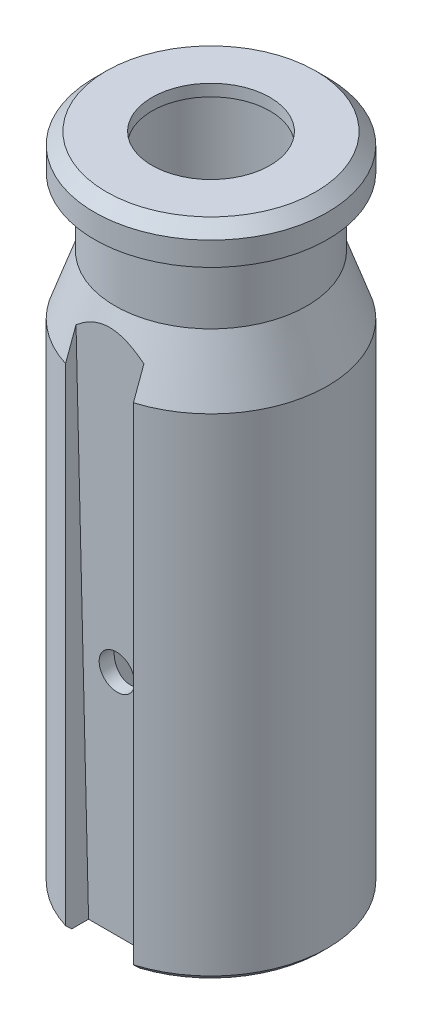
ISO-10303-21;
HEADER;
FILE_DESCRIPTION(('STEP AP214'),'2;1');
FILE_NAME('part.step','',(''),(''),'','','');
FILE_SCHEMA(('AUTOMOTIVE_DESIGN { 1 0 10303 214 1 1 1 1 }'));
ENDSEC;
DATA;
#1=APPLICATION_CONTEXT('core data for automotive mechanical design processes');
#2=APPLICATION_PROTOCOL_DEFINITION('international standard','automotive_design',2000,#1);
#3=PRODUCT_CONTEXT('',#1,'mechanical');
#4=PRODUCT('Part','Part','',(#3));
#5=PRODUCT_RELATED_PRODUCT_CATEGORY('part','',(#4));
#6=PRODUCT_DEFINITION_FORMATION('','',#4);
#7=PRODUCT_DEFINITION_CONTEXT('part definition',#1,'design');
#8=PRODUCT_DEFINITION('design','',#6,#7);
#9=PRODUCT_DEFINITION_SHAPE('','',#8);
#10=(LENGTH_UNIT() NAMED_UNIT(*) SI_UNIT(.MILLI.,.METRE.));
#11=(NAMED_UNIT(*) PLANE_ANGLE_UNIT() SI_UNIT($,.RADIAN.));
#12=(NAMED_UNIT(*) SI_UNIT($,.STERADIAN.) SOLID_ANGLE_UNIT());
#13=UNCERTAINTY_MEASURE_WITH_UNIT(LENGTH_MEASURE(1.E-05),#10,'distance_accuracy_value','');
#14=(GEOMETRIC_REPRESENTATION_CONTEXT(3) GLOBAL_UNCERTAINTY_ASSIGNED_CONTEXT((#13)) GLOBAL_UNIT_ASSIGNED_CONTEXT((#10,
#11,#12)) REPRESENTATION_CONTEXT('',''));
#15=CARTESIAN_POINT('',(0.,0.,0.));
#16=DIRECTION('',(0.,0.,1.));
#17=DIRECTION('',(1.,0.,0.));
#18=AXIS2_PLACEMENT_3D('',#15,#16,#17);
#19=CARTESIAN_POINT('',(1.3,0.,0.));
#20=DIRECTION('',(0.,-1.,0.));
#21=DIRECTION('',(0.,0.,-1.));
#22=AXIS2_PLACEMENT_3D('',#19,#20,#21);
#23=PLANE('',#22);
#24=CARTESIAN_POINT('',(0.,0.,0.));
#25=DIRECTION('',(0.,-1.,0.));
#26=DIRECTION('',(0.,0.,-1.));
#27=AXIS2_PLACEMENT_3D('',#24,#25,#26);
#28=CIRCLE('',#27,1.3);
#29=CARTESIAN_POINT('',(0.,0.,-1.3));
#30=VERTEX_POINT('',#29);
#31=EDGE_CURVE('E222',#30,#30,#28,.T.);
#32=ORIENTED_EDGE('',*,*,#31,.F.);
#33=EDGE_LOOP('',(#32));
#34=FACE_BOUND('',#33,.T.);
#35=CARTESIAN_POINT('',(0.,0.,0.));
#36=DIRECTION('',(0.,-1.,0.));
#37=DIRECTION('',(0.,0.,-1.));
#38=AXIS2_PLACEMENT_3D('',#35,#36,#37);
#39=CIRCLE('',#38,3.75);
#40=CARTESIAN_POINT('',(1.15,0.,-3.56931365951495));
#41=VERTEX_POINT('',#40);
#42=CARTESIAN_POINT('',(1.15,0.,3.56931365951495));
#43=VERTEX_POINT('',#42);
#44=EDGE_CURVE('E116',#41,#43,#39,.T.);
#45=ORIENTED_EDGE('',*,*,#44,.T.);
#46=DIRECTION('',(0.,0.,-1.));
#47=VECTOR('',#46,1.);
#48=CARTESIAN_POINT('',(1.15,0.,3.95));
#49=LINE('',#48,#47);
#50=CARTESIAN_POINT('',(1.15,0.,3.));
#51=VERTEX_POINT('',#50);
#52=EDGE_CURVE('E100',#43,#51,#49,.T.);
#53=ORIENTED_EDGE('',*,*,#52,.T.);
#54=DIRECTION('',(-1.,0.,0.));
#55=VECTOR('',#54,1.);
#56=CARTESIAN_POINT('',(1.15,0.,3.));
#57=LINE('',#56,#55);
#58=CARTESIAN_POINT('',(-1.15,0.,3.));
#59=VERTEX_POINT('',#58);
#60=EDGE_CURVE('E107',#51,#59,#57,.T.);
#61=ORIENTED_EDGE('',*,*,#60,.T.);
#62=DIRECTION('',(0.,0.,1.));
#63=VECTOR('',#62,1.);
#64=CARTESIAN_POINT('',(-1.15,0.,3.95));
#65=LINE('',#64,#63);
#66=CARTESIAN_POINT('',(-1.15,0.,3.56931365951495));
#67=VERTEX_POINT('',#66);
#68=EDGE_CURVE('E111',#59,#67,#65,.T.);
#69=ORIENTED_EDGE('',*,*,#68,.T.);
#70=CARTESIAN_POINT('',(-1.15,0.,-3.56931365951495));
#71=VERTEX_POINT('',#70);
#72=EDGE_CURVE('E126',#67,#71,#39,.T.);
#73=ORIENTED_EDGE('',*,*,#72,.T.);
#74=DIRECTION('',(0.,0.,-1.));
#75=VECTOR('',#74,1.);
#76=CARTESIAN_POINT('',(-1.15,0.,-3.95));
#77=LINE('',#76,#75);
#78=CARTESIAN_POINT('',(-1.15,0.,-3.));
#79=VERTEX_POINT('',#78);
#80=EDGE_CURVE('E140',#79,#71,#77,.T.);
#81=ORIENTED_EDGE('',*,*,#80,.F.);
#82=DIRECTION('',(-1.,0.,0.));
#83=VECTOR('',#82,1.);
#84=CARTESIAN_POINT('',(1.15,0.,-3.));
#85=LINE('',#84,#83);
#86=CARTESIAN_POINT('',(1.15,0.,-3.));
#87=VERTEX_POINT('',#86);
#88=EDGE_CURVE('E144',#87,#79,#85,.T.);
#89=ORIENTED_EDGE('',*,*,#88,.F.);
#90=DIRECTION('',(0.,0.,1.));
#91=VECTOR('',#90,1.);
#92=CARTESIAN_POINT('',(1.15,0.,-3.95));
#93=LINE('',#92,#91);
#94=EDGE_CURVE('E150',#41,#87,#93,.T.);
#95=ORIENTED_EDGE('',*,*,#94,.F.);
#96=EDGE_LOOP('',(#45,#53,#61,#69,#73,#81,#89,#95));
#97=FACE_BOUND('',#96,.T.);
#98=ADVANCED_FACE('F17',(#34,#97),#23,.T.);
#99=CARTESIAN_POINT('',(0.,0.,0.));
#100=DIRECTION('',(0.,1.,0.));
#101=DIRECTION('',(0.,0.,1.));
#102=AXIS2_PLACEMENT_3D('',#99,#100,#101);
#103=CONICAL_SURFACE('',#102,3.75,0.785398163397447);
#104=CARTESIAN_POINT('',(0.,0.2,0.));
#105=DIRECTION('',(0.,-1.,0.));
#106=DIRECTION('',(0.,0.,-1.));
#107=AXIS2_PLACEMENT_3D('',#104,#105,#106);
#108=CIRCLE('',#107,3.95);
#109=CARTESIAN_POINT('',(1.15,0.2,-3.77888872553824));
#110=VERTEX_POINT('',#109);
#111=CARTESIAN_POINT('',(1.15,0.2,3.77888872553824));
#112=VERTEX_POINT('',#111);
#113=EDGE_CURVE('E128',#110,#112,#108,.T.);
#114=ORIENTED_EDGE('',*,*,#113,.T.);
#115=CARTESIAN_POINT('',(1.15,0.200225,3.77912391310804));
#116=CARTESIAN_POINT('',(1.15,0.16675950570913,3.74414562733071));
#117=CARTESIAN_POINT('',(1.15,0.133316342073734,3.70914603116538));
#118=CARTESIAN_POINT('',(1.15,0.0664746754061209,3.63910421731704));
#119=CARTESIAN_POINT('',(1.15,0.0330761723748503,3.60406199963314));
#120=CARTESIAN_POINT('',(1.15,-0.000300000000000059,3.56899847156033));
#121=B_SPLINE_CURVE_WITH_KNOTS('',3,(#115,#116,#117,#118,#119,#120),.UNSPECIFIED.,.F.,.F.,(4,2,
4),(0.,0.14522655518576,0.290453113447055),.UNSPECIFIED.);
#122=EDGE_CURVE('E528',#112,#43,#121,.T.);
#123=ORIENTED_EDGE('',*,*,#122,.T.);
#124=ORIENTED_EDGE('',*,*,#44,.F.);
#125=CARTESIAN_POINT('',(1.15,-0.000200000000000068,-3.56910353450275));
#126=CARTESIAN_POINT('',(1.15,0.0331553961812222,-3.60414514228176));
#127=CARTESIAN_POINT('',(1.15,0.0665330944485576,-3.6391654669155));
#128=CARTESIAN_POINT('',(1.15,0.1333330944495,-3.70916354915272));
#129=CARTESIAN_POINT('',(1.15,0.166755396182165,-3.74414130675709));
#130=CARTESIAN_POINT('',(1.15,0.2002,-3.7790977812171));
#131=B_SPLINE_CURVE_WITH_KNOTS('',3,(#125,#126,#127,#128,#129,#130),.UNSPECIFIED.,.F.,.F.,(4,2,
4),(0.,0.145135953201489,0.290271903335335),.UNSPECIFIED.);
#132=EDGE_CURVE('E220',#41,#110,#131,.T.);
#133=ORIENTED_EDGE('',*,*,#132,.T.);
#134=EDGE_LOOP('',(#114,#123,#124,#133));
#135=FACE_BOUND('',#134,.T.);
#136=ADVANCED_FACE('F193',(#135),#103,.T.);
#137=ORIENTED_EDGE('',*,*,#72,.F.);
#138=CARTESIAN_POINT('',(-1.15,-0.000299999999999731,3.56899847156033));
#139=CARTESIAN_POINT('',(-1.15,0.0330761723748504,3.60406199963314));
#140=CARTESIAN_POINT('',(-1.15,0.0664746754061209,3.63910421731704));
#141=CARTESIAN_POINT('',(-1.15,0.133316342073733,3.70914603116538));
#142=CARTESIAN_POINT('',(-1.15,0.16675950570913,3.74414562733071));
#143=CARTESIAN_POINT('',(-1.15,0.200225,3.77912391310804));
#144=B_SPLINE_CURVE_WITH_KNOTS('',3,(#138,#139,#140,#141,#142,#143),.UNSPECIFIED.,.F.,.F.,(4,2,
4),(0.,0.145226558261294,0.290453113447055),.UNSPECIFIED.);
#145=CARTESIAN_POINT('',(-1.15,0.2,3.77888872553824));
#146=VERTEX_POINT('',#145);
#147=EDGE_CURVE('E118',#67,#146,#144,.T.);
#148=ORIENTED_EDGE('',*,*,#147,.T.);
#149=CARTESIAN_POINT('',(-1.15,0.2,-3.77888872553824));
#150=VERTEX_POINT('',#149);
#151=EDGE_CURVE('E258',#146,#150,#108,.T.);
#152=ORIENTED_EDGE('',*,*,#151,.T.);
#153=CARTESIAN_POINT('',(-1.15,0.2002,-3.7790977812171));
#154=CARTESIAN_POINT('',(-1.15,0.166755396182165,-3.74414130675709));
#155=CARTESIAN_POINT('',(-1.15,0.1333330944495,-3.70916354915272));
#156=CARTESIAN_POINT('',(-1.15,0.0665330944485576,-3.63916546691551));
#157=CARTESIAN_POINT('',(-1.15,0.0331553961812223,-3.60414514228176));
#158=CARTESIAN_POINT('',(-1.15,-0.000199999999999869,-3.56910353450275));
#159=B_SPLINE_CURVE_WITH_KNOTS('',3,(#153,#154,#155,#156,#157,#158),.UNSPECIFIED.,.F.,.F.,(4,2,
4),(0.,0.145135950133845,0.290271903335334),.UNSPECIFIED.);
#160=EDGE_CURVE('E537',#150,#71,#159,.T.);
#161=ORIENTED_EDGE('',*,*,#160,.T.);
#162=EDGE_LOOP('',(#137,#148,#152,#161));
#163=FACE_BOUND('',#162,.T.);
#164=ADVANCED_FACE('F196',(#163),#103,.T.);
#165=CARTESIAN_POINT('',(0.,0.,0.));
#166=DIRECTION('',(0.,-1.,0.));
#167=DIRECTION('',(0.,0.,-1.));
#168=AXIS2_PLACEMENT_3D('',#165,#166,#167);
#169=CYLINDRICAL_SURFACE('',#168,3.95);
#170=CARTESIAN_POINT('',(0.,16.7,0.));
#171=DIRECTION('',(0.,-1.,0.));
#172=DIRECTION('',(0.,0.,-1.));
#173=AXIS2_PLACEMENT_3D('',#170,#171,#172);
#174=CIRCLE('',#173,3.95);
#175=CARTESIAN_POINT('',(1.15,16.7,-3.77888872553824));
#176=VERTEX_POINT('',#175);
#177=CARTESIAN_POINT('',(1.15,16.7,3.77888872553824));
#178=VERTEX_POINT('',#177);
#179=EDGE_CURVE('E255',#176,#178,#174,.T.);
#180=ORIENTED_EDGE('',*,*,#179,.T.);
#181=DIRECTION('',(0.,-1.,0.));
#182=VECTOR('',#181,1.);
#183=CARTESIAN_POINT('',(1.15,0.,3.77888872553824));
#184=LINE('',#183,#182);
#185=EDGE_CURVE('E552',#178,#112,#184,.T.);
#186=ORIENTED_EDGE('',*,*,#185,.T.);
#187=ORIENTED_EDGE('',*,*,#113,.F.);
#188=DIRECTION('',(0.,-1.,0.));
#189=VECTOR('',#188,1.);
#190=CARTESIAN_POINT('',(1.15,0.,-3.77888872553824));
#191=LINE('',#190,#189);
#192=EDGE_CURVE('E535',#110,#176,#191,.F.);
#193=ORIENTED_EDGE('',*,*,#192,.T.);
#194=EDGE_LOOP('',(#180,#186,#187,#193));
#195=FACE_BOUND('',#194,.T.);
#196=ADVANCED_FACE('F198',(#195),#169,.T.);
#197=ORIENTED_EDGE('',*,*,#151,.F.);
#198=DIRECTION('',(0.,-1.,0.));
#199=VECTOR('',#198,1.);
#200=CARTESIAN_POINT('',(-1.15,0.,3.77888872553824));
#201=LINE('',#200,#199);
#202=CARTESIAN_POINT('',(-1.15,16.7,3.77888872553824));
#203=VERTEX_POINT('',#202);
#204=EDGE_CURVE('E117',#146,#203,#201,.F.);
#205=ORIENTED_EDGE('',*,*,#204,.T.);
#206=CARTESIAN_POINT('',(-1.15,16.7,-3.77888872553824));
#207=VERTEX_POINT('',#206);
#208=EDGE_CURVE('E41',#203,#207,#174,.T.);
#209=ORIENTED_EDGE('',*,*,#208,.T.);
#210=DIRECTION('',(0.,-1.,0.));
#211=VECTOR('',#210,1.);
#212=CARTESIAN_POINT('',(-1.15,0.,-3.77888872553824));
#213=LINE('',#212,#211);
#214=EDGE_CURVE('E154',#207,#150,#213,.T.);
#215=ORIENTED_EDGE('',*,*,#214,.T.);
#216=EDGE_LOOP('',(#197,#205,#209,#215));
#217=FACE_BOUND('',#216,.T.);
#218=ADVANCED_FACE('F324',(#217),#169,.T.);
#219=CARTESIAN_POINT('',(0.,16.7,0.));
#220=DIRECTION('',(0.,-1.,0.));
#221=DIRECTION('',(0.,0.,-1.));
#222=AXIS2_PLACEMENT_3D('',#219,#220,#221);
#223=CONICAL_SURFACE('',#222,3.95,0.336674819386727);
#224=CARTESIAN_POINT('',(0.,18.7,0.));
#225=DIRECTION('',(0.,-1.,0.));
#226=DIRECTION('',(0.,0.,-1.));
#227=AXIS2_PLACEMENT_3D('',#224,#225,#226);
#228=CIRCLE('',#227,3.25);
#229=CARTESIAN_POINT('',(0.,18.7,-3.25));
#230=VERTEX_POINT('',#229);
#231=EDGE_CURVE('E252',#230,#230,#228,.T.);
#232=ORIENTED_EDGE('',*,*,#231,.T.);
#233=EDGE_LOOP('',(#232));
#234=FACE_BOUND('',#233,.T.);
#235=CARTESIAN_POINT('',(-1.1503,17.6627331962136,3.42503903413348));
#236=CARTESIAN_POINT('',(-1.11340986937978,17.6942265538726,3.42579689568143));
#237=CARTESIAN_POINT('',(-1.07584878108211,17.7249329414148,3.42653581944581));
#238=CARTESIAN_POINT('',(-0.999194089284043,17.7844779764666,3.42796872135882));
#239=CARTESIAN_POINT('',(-0.960098448803349,17.813313996706,3.42866263628437));
#240=CARTESIAN_POINT('',(-0.838767381594023,17.8975653770501,3.43069007591832));
#241=CARTESIAN_POINT('',(-0.753966097119917,17.9494222485725,3.43193796854854));
#242=CARTESIAN_POINT('',(-0.576330428398146,18.0398971314686,3.43411517161288));
#243=CARTESIAN_POINT('',(-0.483428009821175,18.0783860796479,3.43504137624821));
#244=CARTESIAN_POINT('',(-0.292371766603162,18.1355722067019,3.4364175129955));
#245=CARTESIAN_POINT('',(-0.194277493685058,18.1544573983353,3.43687196947866));
#246=CARTESIAN_POINT('',(-0.0102472295720071,18.1681115244492,3.437200544706));
#247=CARTESIAN_POINT('',(0.0754639963956187,18.1658918347715,3.43714712971375));
#248=CARTESIAN_POINT('',(0.244991873251715,18.1448144305306,3.43663991945127));
#249=CARTESIAN_POINT('',(0.328801908076904,18.1259057137957,3.43618489685605));
#250=CARTESIAN_POINT('',(0.507408868400063,18.0692770282759,3.43482217447723));
#251=CARTESIAN_POINT('',(0.60125689990116,18.028659491094,3.43384474711189));
#252=CARTESIAN_POINT('',(0.78153405653423,17.9334249535095,3.43155300690264));
#253=CARTESIAN_POINT('',(0.867945385931423,17.8787755545299,3.43023791441382));
#254=CARTESIAN_POINT('',(0.985331128168245,17.7947107302308,3.42821496409646));
#255=CARTESIAN_POINT('',(1.01920945671224,17.7691972895163,3.42760100429317));
#256=CARTESIAN_POINT('',(1.08565647121131,17.7168954142107,3.42634240301577));
#257=CARTESIAN_POINT('',(1.11823151905257,17.6901150719987,3.42569795627804));
#258=CARTESIAN_POINT('',(1.1503,17.6627331962136,3.42503903413348));
#259=B_SPLINE_CURVE_WITH_KNOTS('',3,(#235,#236,#237,#238,#239,#240,#241,#242,#243,#244,#245,
#246,#247,#248,#249,#250,#251,#252,#253,#254,#255,#256,#257,#258),.UNSPECIFIED.,.F.,.F.,(4,2,2,
2,2,2,2,2,2,2,2,4),(0.,0.14550977082224,0.291219697585221,0.588520120205237,0.888615916346047,
1.18580623469195,1.44130702487727,1.69759134729063,2.0027028441205,2.30852525816984,
2.4357464331425,2.56224277385796),.UNSPECIFIED.);
#260=CARTESIAN_POINT('',(-1.15,17.6629893599923,3.42504519850249));
#261=VERTEX_POINT('',#260);
#262=CARTESIAN_POINT('',(1.15,17.6629893599923,3.42504519850249));
#263=VERTEX_POINT('',#262);
#264=EDGE_CURVE('E25',#261,#263,#259,.T.);
#265=ORIENTED_EDGE('',*,*,#264,.T.);
#266=CARTESIAN_POINT('',(1.15,18.7002,3.03966198859347));
#267=CARTESIAN_POINT('',(1.15,18.5337505302106,3.10194646119254));
#268=CARTESIAN_POINT('',(1.15,18.3672243723403,3.1640255817215));
#269=CARTESIAN_POINT('',(1.15,18.0340409723636,3.28782941284661));
#270=CARTESIAN_POINT('',(1.15,17.8673837306944,3.3495541246194));
#271=CARTESIAN_POINT('',(1.15,17.5339595001939,3.47270578961336));
#272=CARTESIAN_POINT('',(1.15,17.3671925114622,3.5341327431047));
#273=CARTESIAN_POINT('',(1.15,17.0335635195748,3.65672982321873));
#274=CARTESIAN_POINT('',(1.15,16.866701516106,3.71789994898949));
#275=CARTESIAN_POINT('',(1.15,16.6998,3.77896189513734));
#276=B_SPLINE_CURVE_WITH_KNOTS('',3,(#266,#267,#268,#269,#270,#271,#272,#273,#274,#275),
.UNSPECIFIED.,.F.,.F.,(4,2,2,2,4),(0.,0.533162891940487,1.06632401278206,1.59948464980143,
2.13264705396192),.UNSPECIFIED.);
#277=EDGE_CURVE('E11',#263,#178,#276,.T.);
#278=ORIENTED_EDGE('',*,*,#277,.T.);
#279=ORIENTED_EDGE('',*,*,#179,.F.);
#280=CARTESIAN_POINT('',(1.15,16.6998,-3.77896189513734));
#281=CARTESIAN_POINT('',(1.15,16.866701516106,-3.71789994898949));
#282=CARTESIAN_POINT('',(1.15,17.0335635195748,-3.65672982321873));
#283=CARTESIAN_POINT('',(1.15,17.3671925114622,-3.5341327431047));
#284=CARTESIAN_POINT('',(1.15,17.5339595001939,-3.47270578961337));
#285=CARTESIAN_POINT('',(1.15,17.8673837306944,-3.3495541246194));
#286=CARTESIAN_POINT('',(1.15,18.0340409723636,-3.28782941284661));
#287=CARTESIAN_POINT('',(1.15,18.3672243723403,-3.1640255817215));
#288=CARTESIAN_POINT('',(1.15,18.5337505302106,-3.10194646119254));
#289=CARTESIAN_POINT('',(1.15,18.7002,-3.03966198859348));
#290=B_SPLINE_CURVE_WITH_KNOTS('',3,(#280,#281,#282,#283,#284,#285,#286,#287,#288,#289),
.UNSPECIFIED.,.F.,.F.,(4,2,2,2,4),(0.,0.533162404160496,1.06632304117986,1.59948416202143,
2.13264705396192),.UNSPECIFIED.);
#291=CARTESIAN_POINT('',(1.15,17.6629893599923,-3.42504519850249));
#292=VERTEX_POINT('',#291);
#293=EDGE_CURVE('E164',#176,#292,#290,.T.);
#294=ORIENTED_EDGE('',*,*,#293,.T.);
#295=CARTESIAN_POINT('',(1.1503,17.6627331962136,-3.42503903413348));
#296=CARTESIAN_POINT('',(1.11340986937978,17.6942265538726,-3.42579689568143));
#297=CARTESIAN_POINT('',(1.07584878108211,17.7249329414148,-3.42653581944581));
#298=CARTESIAN_POINT('',(0.999194089284043,17.7844779764666,-3.42796872135882));
#299=CARTESIAN_POINT('',(0.960098448803349,17.813313996706,-3.42866263628437));
#300=CARTESIAN_POINT('',(0.838767381594022,17.8975653770501,-3.43069007591832));
#301=CARTESIAN_POINT('',(0.753966097119915,17.9494222485725,-3.43193796854854));
#302=CARTESIAN_POINT('',(0.576330428398144,18.0398971314686,-3.43411517161288));
#303=CARTESIAN_POINT('',(0.483428009821173,18.0783860796479,-3.43504137624821));
#304=CARTESIAN_POINT('',(0.292371766603159,18.1355722067019,-3.4364175129955));
#305=CARTESIAN_POINT('',(0.194277493685054,18.1544573983353,-3.43687196947866));
#306=CARTESIAN_POINT('',(0.0102472295720029,18.1681115244492,-3.437200544706));
#307=CARTESIAN_POINT('',(-0.0754639963956222,18.1658918347715,-3.43714712971375));
#308=CARTESIAN_POINT('',(-0.244991873251718,18.1448144305306,-3.43663991945127));
#309=CARTESIAN_POINT('',(-0.328801908076907,18.1259057137957,-3.43618489685605));
#310=CARTESIAN_POINT('',(-0.507408868400066,18.0692770282759,-3.43482217447723));
#311=CARTESIAN_POINT('',(-0.601256899901163,18.028659491094,-3.43384474711189));
#312=CARTESIAN_POINT('',(-0.781534056534232,17.9334249535095,-3.43155300690264));
#313=CARTESIAN_POINT('',(-0.867945385931425,17.8787755545299,-3.43023791441382));
#314=CARTESIAN_POINT('',(-0.985331128168246,17.7947107302308,-3.42821496409646));
#315=CARTESIAN_POINT('',(-1.01920945671224,17.7691972895163,-3.42760100429317));
#316=CARTESIAN_POINT('',(-1.08565647121131,17.7168954142107,-3.42634240301577));
#317=CARTESIAN_POINT('',(-1.11823151905257,17.6901150719987,-3.42569795627804));
#318=CARTESIAN_POINT('',(-1.1503,17.6627331962136,-3.42503903413348));
#319=B_SPLINE_CURVE_WITH_KNOTS('',3,(#295,#296,#297,#298,#299,#300,#301,#302,#303,#304,#305,
#306,#307,#308,#309,#310,#311,#312,#313,#314,#315,#316,#317,#318),.UNSPECIFIED.,.F.,.F.,(4,2,2,
2,2,2,2,2,2,2,2,4),(0.,0.145509770822242,0.291219697585223,0.58852012020524,0.888615916346052,
1.18580623469195,1.44130702487728,1.69759134729064,2.0027028441205,2.30852525816984,
2.43574643314251,2.56224277385796),.UNSPECIFIED.);
#320=CARTESIAN_POINT('',(-1.15,17.6629893599923,-3.42504519850249));
#321=VERTEX_POINT('',#320);
#322=EDGE_CURVE('E268',#292,#321,#319,.T.);
#323=ORIENTED_EDGE('',*,*,#322,.T.);
#324=CARTESIAN_POINT('',(-1.15,18.7002,-3.03966198859347));
#325=CARTESIAN_POINT('',(-1.15,18.5337505302106,-3.10194646119254));
#326=CARTESIAN_POINT('',(-1.15,18.3672243723403,-3.1640255817215));
#327=CARTESIAN_POINT('',(-1.15,18.0340409723636,-3.28782941284661));
#328=CARTESIAN_POINT('',(-1.15,17.8673837306944,-3.3495541246194));
#329=CARTESIAN_POINT('',(-1.15,17.5339595001939,-3.47270578961336));
#330=CARTESIAN_POINT('',(-1.15,17.3671925114622,-3.5341327431047));
#331=CARTESIAN_POINT('',(-1.15,17.0335635195748,-3.65672982321872));
#332=CARTESIAN_POINT('',(-1.15,16.866701516106,-3.71789994898949));
#333=CARTESIAN_POINT('',(-1.15,16.6998,-3.77896189513734));
#334=B_SPLINE_CURVE_WITH_KNOTS('',3,(#324,#325,#326,#327,#328,#329,#330,#331,#332,#333),
.UNSPECIFIED.,.F.,.F.,(4,2,2,2,4),(0.,0.533162891940483,1.06632401278206,1.59948464980142,
2.13264705396192),.UNSPECIFIED.);
#335=EDGE_CURVE('E261',#321,#207,#334,.T.);
#336=ORIENTED_EDGE('',*,*,#335,.T.);
#337=ORIENTED_EDGE('',*,*,#208,.F.);
#338=CARTESIAN_POINT('',(-1.15,16.6998,3.77896189513734));
#339=CARTESIAN_POINT('',(-1.15,16.866701516106,3.71789994898949));
#340=CARTESIAN_POINT('',(-1.15,17.0335635195748,3.65672982321873));
#341=CARTESIAN_POINT('',(-1.15,17.3671925114622,3.5341327431047));
#342=CARTESIAN_POINT('',(-1.15,17.5339595001939,3.47270578961337));
#343=CARTESIAN_POINT('',(-1.15,17.8673837306944,3.3495541246194));
#344=CARTESIAN_POINT('',(-1.15,18.0340409723636,3.28782941284661));
#345=CARTESIAN_POINT('',(-1.15,18.3672243723403,3.1640255817215));
#346=CARTESIAN_POINT('',(-1.15,18.5337505302106,3.10194646119255));
#347=CARTESIAN_POINT('',(-1.15,18.7002,3.03966198859348));
#348=B_SPLINE_CURVE_WITH_KNOTS('',3,(#338,#339,#340,#341,#342,#343,#344,#345,#346,#347),
.UNSPECIFIED.,.F.,.F.,(4,2,2,2,4),(0.,0.533162404160496,1.06632304117986,1.59948416202143,
2.13264705396192),.UNSPECIFIED.);
#349=EDGE_CURVE('E157',#203,#261,#348,.T.);
#350=ORIENTED_EDGE('',*,*,#349,.T.);
#351=EDGE_LOOP('',(#265,#278,#279,#294,#323,#336,#337,#350));
#352=FACE_BOUND('',#351,.T.);
#353=ADVANCED_FACE('F170',(#234,#352),#223,.T.);
#354=CARTESIAN_POINT('',(0.,0.,0.));
#355=DIRECTION('',(0.,-1.,0.));
#356=DIRECTION('',(0.,0.,-1.));
#357=AXIS2_PLACEMENT_3D('',#354,#355,#356);
#358=CYLINDRICAL_SURFACE('',#357,3.25);
#359=CARTESIAN_POINT('',(0.,21.,0.));
#360=DIRECTION('',(0.,-1.,0.));
#361=DIRECTION('',(0.,0.,-1.));
#362=AXIS2_PLACEMENT_3D('',#359,#360,#361);
#363=CIRCLE('',#362,3.25);
#364=CARTESIAN_POINT('',(0.,21.,-3.25));
#365=VERTEX_POINT('',#364);
#366=EDGE_CURVE('E249',#365,#365,#363,.T.);
#367=ORIENTED_EDGE('',*,*,#366,.T.);
#368=EDGE_LOOP('',(#367));
#369=FACE_BOUND('',#368,.T.);
#370=ORIENTED_EDGE('',*,*,#231,.F.);
#371=EDGE_LOOP('',(#370));
#372=FACE_BOUND('',#371,.T.);
#373=ADVANCED_FACE('F315',(#369,#372),#358,.T.);
#374=CARTESIAN_POINT('',(3.25,21.,0.));
#375=DIRECTION('',(0.,-1.,0.));
#376=DIRECTION('',(0.,0.,-1.));
#377=AXIS2_PLACEMENT_3D('',#374,#375,#376);
#378=PLANE('',#377);
#379=CARTESIAN_POINT('',(0.,21.,0.));
#380=DIRECTION('',(0.,-1.,0.));
#381=DIRECTION('',(0.,0.,-1.));
#382=AXIS2_PLACEMENT_3D('',#379,#380,#381);
#383=CIRCLE('',#382,3.95);
#384=CARTESIAN_POINT('',(0.,21.,-3.95));
#385=VERTEX_POINT('',#384);
#386=EDGE_CURVE('E246',#385,#385,#383,.T.);
#387=ORIENTED_EDGE('',*,*,#386,.T.);
#388=EDGE_LOOP('',(#387));
#389=FACE_BOUND('',#388,.T.);
#390=ORIENTED_EDGE('',*,*,#366,.F.);
#391=EDGE_LOOP('',(#390));
#392=FACE_BOUND('',#391,.T.);
#393=ADVANCED_FACE('F312',(#389,#392),#378,.T.);
#394=CARTESIAN_POINT('',(0.,0.,0.));
#395=DIRECTION('',(0.,-1.,0.));
#396=DIRECTION('',(0.,0.,-1.));
#397=AXIS2_PLACEMENT_3D('',#394,#395,#396);
#398=CYLINDRICAL_SURFACE('',#397,3.95);
#399=CARTESIAN_POINT('',(0.,21.8,0.));
#400=DIRECTION('',(0.,-1.,0.));
#401=DIRECTION('',(0.,0.,-1.));
#402=AXIS2_PLACEMENT_3D('',#399,#400,#401);
#403=CIRCLE('',#402,3.95);
#404=CARTESIAN_POINT('',(0.,21.8,-3.95));
#405=VERTEX_POINT('',#404);
#406=EDGE_CURVE('E243',#405,#405,#403,.T.);
#407=ORIENTED_EDGE('',*,*,#406,.T.);
#408=EDGE_LOOP('',(#407));
#409=FACE_BOUND('',#408,.T.);
#410=ORIENTED_EDGE('',*,*,#386,.F.);
#411=EDGE_LOOP('',(#410));
#412=FACE_BOUND('',#411,.T.);
#413=ADVANCED_FACE('F308',(#409,#412),#398,.T.);
#414=CARTESIAN_POINT('',(0.,21.8,0.));
#415=DIRECTION('',(0.,-1.,0.));
#416=DIRECTION('',(0.,0.,-1.));
#417=AXIS2_PLACEMENT_3D('',#414,#415,#416);
#418=CONICAL_SURFACE('',#417,3.95,0.785398163397447);
#419=CARTESIAN_POINT('',(0.,22.2,0.));
#420=DIRECTION('',(0.,-1.,0.));
#421=DIRECTION('',(0.,0.,-1.));
#422=AXIS2_PLACEMENT_3D('',#419,#420,#421);
#423=CIRCLE('',#422,3.55);
#424=CARTESIAN_POINT('',(0.,22.2,-3.55));
#425=VERTEX_POINT('',#424);
#426=EDGE_CURVE('E240',#425,#425,#423,.T.);
#427=ORIENTED_EDGE('',*,*,#426,.T.);
#428=EDGE_LOOP('',(#427));
#429=FACE_BOUND('',#428,.T.);
#430=ORIENTED_EDGE('',*,*,#406,.F.);
#431=EDGE_LOOP('',(#430));
#432=FACE_BOUND('',#431,.T.);
#433=ADVANCED_FACE('F304',(#429,#432),#418,.T.);
#434=CARTESIAN_POINT('',(3.55,22.2,0.));
#435=DIRECTION('',(0.,1.,0.));
#436=DIRECTION('',(0.,0.,1.));
#437=AXIS2_PLACEMENT_3D('',#434,#435,#436);
#438=PLANE('',#437);
#439=CARTESIAN_POINT('',(0.,22.2,0.));
#440=DIRECTION('',(0.,-1.,0.));
#441=DIRECTION('',(0.,0.,-1.));
#442=AXIS2_PLACEMENT_3D('',#439,#440,#441);
#443=CIRCLE('',#442,2.00000000000001);
#444=CARTESIAN_POINT('',(0.,22.2,-2.00000000000001));
#445=VERTEX_POINT('',#444);
#446=EDGE_CURVE('E237',#445,#445,#443,.T.);
#447=ORIENTED_EDGE('',*,*,#446,.T.);
#448=EDGE_LOOP('',(#447));
#449=FACE_BOUND('',#448,.T.);
#450=ORIENTED_EDGE('',*,*,#426,.F.);
#451=EDGE_LOOP('',(#450));
#452=FACE_BOUND('',#451,.T.);
#453=ADVANCED_FACE('F300',(#449,#452),#438,.T.);
#454=CARTESIAN_POINT('',(0.,0.,0.));
#455=DIRECTION('',(0.,-1.,0.));
#456=DIRECTION('',(0.,0.,-1.));
#457=AXIS2_PLACEMENT_3D('',#454,#455,#456);
#458=CYLINDRICAL_SURFACE('',#457,2.00000000000001);
#459=CARTESIAN_POINT('',(0.,21.8,0.));
#460=DIRECTION('',(0.,-1.,0.));
#461=DIRECTION('',(0.,0.,-1.));
#462=AXIS2_PLACEMENT_3D('',#459,#460,#461);
#463=CIRCLE('',#462,2.00000000000001);
#464=CARTESIAN_POINT('',(0.,21.8,-2.00000000000001));
#465=VERTEX_POINT('',#464);
#466=EDGE_CURVE('E234',#465,#465,#463,.T.);
#467=ORIENTED_EDGE('',*,*,#466,.T.);
#468=EDGE_LOOP('',(#467));
#469=FACE_BOUND('',#468,.T.);
#470=ORIENTED_EDGE('',*,*,#446,.F.);
#471=EDGE_LOOP('',(#470));
#472=FACE_BOUND('',#471,.T.);
#473=ADVANCED_FACE('F296',(#469,#472),#458,.F.);
#474=CARTESIAN_POINT('',(2.00000000000001,21.8,0.));
#475=DIRECTION('',(0.,-1.,0.));
#476=DIRECTION('',(0.,0.,-1.));
#477=AXIS2_PLACEMENT_3D('',#474,#475,#476);
#478=PLANE('',#477);
#479=CARTESIAN_POINT('',(0.,21.8,0.));
#480=DIRECTION('',(0.,-1.,0.));
#481=DIRECTION('',(0.,0.,-1.));
#482=AXIS2_PLACEMENT_3D('',#479,#480,#481);
#483=CIRCLE('',#482,2.75000000000001);
#484=CARTESIAN_POINT('',(0.,21.8,-2.75000000000001));
#485=VERTEX_POINT('',#484);
#486=EDGE_CURVE('E231',#485,#485,#483,.T.);
#487=ORIENTED_EDGE('',*,*,#486,.T.);
#488=EDGE_LOOP('',(#487));
#489=FACE_BOUND('',#488,.T.);
#490=ORIENTED_EDGE('',*,*,#466,.F.);
#491=EDGE_LOOP('',(#490));
#492=FACE_BOUND('',#491,.T.);
#493=ADVANCED_FACE('F292',(#489,#492),#478,.T.);
#494=CARTESIAN_POINT('',(0.,0.,0.));
#495=DIRECTION('',(0.,-1.,0.));
#496=DIRECTION('',(0.,0.,-1.));
#497=AXIS2_PLACEMENT_3D('',#494,#495,#496);
#498=CYLINDRICAL_SURFACE('',#497,2.75000000000001);
#499=CARTESIAN_POINT('',(0.,7.33596583134108,2.75000000000001));
#500=CARTESIAN_POINT('',(0.0331659214326952,7.33596699578586,2.74999938913567));
#501=CARTESIAN_POINT('',(0.0663456058881966,7.33874069463018,2.74939388629404));
#502=CARTESIAN_POINT('',(0.131759530532624,7.34974693079521,2.74703717017002));
#503=CARTESIAN_POINT('',(0.163993071542689,7.35798340395398,2.7452851308393));
#504=CARTESIAN_POINT('',(0.226556699836022,7.37963353578691,2.74083106153913));
#505=CARTESIAN_POINT('',(0.256888988161396,7.39304107434399,2.73813015491918));
#506=CARTESIAN_POINT('',(0.314881423767141,7.42462429093625,2.73206898186275));
#507=CARTESIAN_POINT('',(0.342541607435513,7.44279990402856,2.72870872440702));
#508=CARTESIAN_POINT('',(0.394934724379752,7.48375941285474,2.7216241914402));
#509=CARTESIAN_POINT('',(0.419609415411235,7.50661689648398,2.71789466748437));
#510=CARTESIAN_POINT('',(0.464829691393052,7.55612118709563,2.71052752197805));
#511=CARTESIAN_POINT('',(0.485374788627002,7.58276844102647,2.70688991132707));
#512=CARTESIAN_POINT('',(0.522071334829777,7.63960060596122,2.70005492219873));
#513=CARTESIAN_POINT('',(0.53814770760675,7.66983504137468,2.69686546559033));
#514=CARTESIAN_POINT('',(0.564981037349098,7.73265473475451,2.69137237003753));
#515=CARTESIAN_POINT('',(0.575738545462899,7.76523974874939,2.68906863931844));
#516=CARTESIAN_POINT('',(0.5914682398766,7.83135437276796,2.68565259199219));
#517=CARTESIAN_POINT('',(0.596519615386489,7.86486426901519,2.68452398482042));
#518=CARTESIAN_POINT('',(0.600923530968317,7.93227326580655,2.68354176699104));
#519=CARTESIAN_POINT('',(0.600276914108151,7.96617230803189,2.68368796771441));
#520=CARTESIAN_POINT('',(0.593370128271301,8.03261474480009,2.68522316717104));
#521=CARTESIAN_POINT('',(0.58723243813251,8.06517158665916,2.68658504857318));
#522=CARTESIAN_POINT('',(0.569697647911581,8.12877168282488,2.69035764949983));
#523=CARTESIAN_POINT('',(0.558300395597492,8.15981489329246,2.69276839938252));
#524=CARTESIAN_POINT('',(0.530543545687235,8.21962928201133,2.69837423152007));
#525=CARTESIAN_POINT('',(0.514169413331348,8.24839349010891,2.70157160579332));
#526=CARTESIAN_POINT('',(0.476932075113571,8.30279653466839,2.70839307430804));
#527=CARTESIAN_POINT('',(0.456068325077486,8.32843499167596,2.71201722025319));
#528=CARTESIAN_POINT('',(0.409954186175092,8.37640123295886,2.71937350145316));
#529=CARTESIAN_POINT('',(0.3846247636183,8.39865297953102,2.72310635047855));
#530=CARTESIAN_POINT('',(0.330561152019509,8.43862055163096,2.73019623660498));
#531=CARTESIAN_POINT('',(0.301826851565273,8.45633622867238,2.73355326140156));
#532=CARTESIAN_POINT('',(0.241580623476384,8.48681059032789,2.73953620687157));
#533=CARTESIAN_POINT('',(0.210055315392808,8.49954361220255,2.74215832332228));
#534=CARTESIAN_POINT('',(0.145248745668964,8.51953700935685,2.74635322578008));
#535=CARTESIAN_POINT('',(0.111967681874761,8.52679799984495,2.74792612974553));
#536=CARTESIAN_POINT('',(0.0451379243216196,8.53555090282971,2.74982960280356));
#537=CARTESIAN_POINT('',(0.0116010548274332,8.53712911802085,2.75017875447943));
#538=CARTESIAN_POINT('',(-0.0552593011442838,8.53470683778165,2.74964796620387));
#539=CARTESIAN_POINT('',(-0.0885827994143573,8.53070665337748,2.74876809477717));
#540=CARTESIAN_POINT('',(-0.153755156429979,8.51731664959835,2.7458904378985));
#541=CARTESIAN_POINT('',(-0.185614755583385,8.50797671682825,2.74390300412756));
#542=CARTESIAN_POINT('',(-0.247309030666511,8.48422286686041,2.73903206712824));
#543=CARTESIAN_POINT('',(-0.277143552273508,8.46980856348267,2.73614849570215));
#544=CARTESIAN_POINT('',(-0.33432770848059,8.43611257736701,2.72975518369503));
#545=CARTESIAN_POINT('',(-0.361644018784109,8.41677568184482,2.72623848236448));
#546=CARTESIAN_POINT('',(-0.412665542952714,8.37384467740273,2.7189837080645));
#547=CARTESIAN_POINT('',(-0.436370384028618,8.35025012954061,2.71524561229715));
#548=CARTESIAN_POINT('',(-0.479830546224975,8.29907100141773,2.70790623688848));
#549=CARTESIAN_POINT('',(-0.499526731409327,8.27143576635172,2.70430756335646));
#550=CARTESIAN_POINT('',(-0.533984262599396,8.2131767313112,2.69771567115481));
#551=CARTESIAN_POINT('',(-0.548745935052892,8.18255312920843,2.69472241243852));
#552=CARTESIAN_POINT('',(-0.572787027348499,8.11943704146855,2.68971477334224));
#553=CARTESIAN_POINT('',(-0.582110502084632,8.08696198189943,2.6876925509257));
#554=CARTESIAN_POINT('',(-0.595169117521035,8.02085828979291,2.68483131604561));
#555=CARTESIAN_POINT('',(-0.598905056899758,7.98722982282584,2.68399213448));
#556=CARTESIAN_POINT('',(-0.600662252487389,7.92047358987892,2.68359934392617));
#557=CARTESIAN_POINT('',(-0.598793134074382,7.88734879078932,2.68402107318849));
#558=CARTESIAN_POINT('',(-0.589653341936792,7.82189161719763,2.68604363558474));
#559=CARTESIAN_POINT('',(-0.582382581246216,7.78955925546238,2.68764448770245));
#560=CARTESIAN_POINT('',(-0.562663449421889,7.72653184172611,2.69184150866654));
#561=CARTESIAN_POINT('',(-0.550207191918937,7.69583936431469,2.69443919307389));
#562=CARTESIAN_POINT('',(-0.520486299463961,7.63695199944261,2.70033748889517));
#563=CARTESIAN_POINT('',(-0.503221071461974,7.60875742059243,2.70363818699406));
#564=CARTESIAN_POINT('',(-0.463900810381157,7.55497280723304,2.71066466966109));
#565=CARTESIAN_POINT('',(-0.441744505682851,7.52945782610721,2.71439850151395));
#566=CARTESIAN_POINT('',(-0.393473859686591,7.48247444285014,2.72181436054254));
#567=CARTESIAN_POINT('',(-0.367358611983683,7.4610069699329,2.72549637564323));
#568=CARTESIAN_POINT('',(-0.311547815385953,7.42250997502106,2.73244152633115));
#569=CARTESIAN_POINT('',(-0.281815474978944,7.40553279847281,2.73569951394516));
#570=CARTESIAN_POINT('',(-0.219843861373389,7.37687324744432,2.74137433232467));
#571=CARTESIAN_POINT('',(-0.187606840840383,7.3651861782655,2.74379190846829));
#572=CARTESIAN_POINT('',(-0.129438338875106,7.34958942102422,2.7470680319333));
#573=CARTESIAN_POINT('',(-0.103832293363478,7.34449068910323,2.74816069237013));
#574=CARTESIAN_POINT('',(-0.0521536524512231,7.33767852567912,2.74962689762756));
#575=CARTESIAN_POINT('',(-0.0260810817285898,7.33596491564273,2.7500004803727));
#576=CARTESIAN_POINT('',(0.,7.33596583134108,2.75000000000001));
#577=B_SPLINE_CURVE_WITH_KNOTS('',3,(#499,#500,#501,#502,#503,#504,#505,#506,#507,#508,#509,
#510,#511,#512,#513,#514,#515,#516,#517,#518,#519,#520,#521,#522,#523,#524,#525,#526,#527,#528,
#529,#530,#531,#532,#533,#534,#535,#536,#537,#538,#539,#540,#541,#542,#543,#544,#545,#546,#547,
#548,#549,#550,#551,#552,#553,#554,#555,#556,#557,#558,#559,#560,#561,#562,#563,#564,#565,#566,
#567,#568,#569,#570,#571,#572,#573,#574,#575,#576),.UNSPECIFIED.,.T.,.F.,(4,2,2,2,2,2,2,2,2,2,2,
2,2,2,2,2,2,2,2,2,2,2,2,2,2,2,2,2,2,2,2,2,2,2,2,2,2,2,4),(0.,0.0994019643308978,
0.198875624035762,0.298231913058714,0.397586848883734,0.498643271329209,0.599711621812399,
0.702387423218752,0.805052582979554,0.90627475428671,1.00748194913828,1.10648648485333,
1.20549388632004,1.30479325901255,1.40410467429475,1.50539243788491,1.60668351666419,
1.70848962813796,1.81028429206602,1.91052635086101,2.01076282083882,2.11007778704159,
2.2094003131467,2.30989012351191,2.41039029978842,2.51227995869269,2.61416287564688,
2.71520854446923,2.81623976851249,2.91530796504716,3.01437775660614,3.11359877222943,
3.2128320293693,3.31435359881409,3.41589844695179,3.51857951385573,3.62116927706647,
3.69934130983576,3.77750921965722),.UNSPECIFIED.);
#578=CARTESIAN_POINT('',(0.,7.33596583134108,2.75000000000001));
#579=VERTEX_POINT('',#578);
#580=EDGE_CURVE('E507',#579,#579,#577,.T.);
#581=ORIENTED_EDGE('',*,*,#580,.T.);
#582=EDGE_LOOP('',(#581));
#583=FACE_BOUND('',#582,.T.);
#584=CARTESIAN_POINT('',(0.,4.,0.));
#585=DIRECTION('',(0.,-1.,0.));
#586=DIRECTION('',(0.,0.,-1.));
#587=AXIS2_PLACEMENT_3D('',#584,#585,#586);
#588=CIRCLE('',#587,2.75000000000002);
#589=CARTESIAN_POINT('',(0.,4.,-2.75000000000002));
#590=VERTEX_POINT('',#589);
#591=EDGE_CURVE('E228',#590,#590,#588,.T.);
#592=ORIENTED_EDGE('',*,*,#591,.T.);
#593=EDGE_LOOP('',(#592));
#594=FACE_BOUND('',#593,.T.);
#595=ORIENTED_EDGE('',*,*,#486,.F.);
#596=EDGE_LOOP('',(#595));
#597=FACE_BOUND('',#596,.T.);
#598=ADVANCED_FACE('F288',(#583,#594,#597),#498,.F.);
#599=CARTESIAN_POINT('',(1.3,4.,0.));
#600=DIRECTION('',(0.,1.,0.));
#601=DIRECTION('',(0.,0.,1.));
#602=AXIS2_PLACEMENT_3D('',#599,#600,#601);
#603=PLANE('',#602);
#604=CARTESIAN_POINT('',(0.,4.,0.));
#605=DIRECTION('',(0.,-1.,0.));
#606=DIRECTION('',(0.,0.,-1.));
#607=AXIS2_PLACEMENT_3D('',#604,#605,#606);
#608=CIRCLE('',#607,1.3);
#609=CARTESIAN_POINT('',(0.,4.,-1.3));
#610=VERTEX_POINT('',#609);
#611=EDGE_CURVE('E225',#610,#610,#608,.T.);
#612=ORIENTED_EDGE('',*,*,#611,.T.);
#613=EDGE_LOOP('',(#612));
#614=FACE_BOUND('',#613,.T.);
#615=ORIENTED_EDGE('',*,*,#591,.F.);
#616=EDGE_LOOP('',(#615));
#617=FACE_BOUND('',#616,.T.);
#618=ADVANCED_FACE('F284',(#614,#617),#603,.T.);
#619=CARTESIAN_POINT('',(0.,0.,0.));
#620=DIRECTION('',(0.,-1.,0.));
#621=DIRECTION('',(0.,0.,-1.));
#622=AXIS2_PLACEMENT_3D('',#619,#620,#621);
#623=CYLINDRICAL_SURFACE('',#622,1.3);
#624=ORIENTED_EDGE('',*,*,#31,.T.);
#625=EDGE_LOOP('',(#624));
#626=FACE_BOUND('',#625,.T.);
#627=ORIENTED_EDGE('',*,*,#611,.F.);
#628=EDGE_LOOP('',(#627));
#629=FACE_BOUND('',#628,.T.);
#630=ADVANCED_FACE('F280',(#626,#629),#623,.F.);
#631=CARTESIAN_POINT('',(1.15,0.,0.));
#632=DIRECTION('',(-1.,0.,0.));
#633=DIRECTION('',(0.,0.,1.));
#634=AXIS2_PLACEMENT_3D('',#631,#632,#633);
#635=PLANE('',#634);
#636=ORIENTED_EDGE('',*,*,#94,.T.);
#637=DIRECTION('',(0.,-0.999710583525427,0.0240572065554248));
#638=VECTOR('',#637,1.);
#639=CARTESIAN_POINT('',(1.15,18.7,-3.45));
#640=LINE('',#639,#638);
#641=EDGE_CURVE('E533',#292,#87,#640,.T.);
#642=ORIENTED_EDGE('',*,*,#641,.F.);
#643=ORIENTED_EDGE('',*,*,#293,.F.);
#644=ORIENTED_EDGE('',*,*,#192,.F.);
#645=ORIENTED_EDGE('',*,*,#132,.F.);
#646=EDGE_LOOP('',(#636,#642,#643,#644,#645));
#647=FACE_BOUND('',#646,.T.);
#648=ADVANCED_FACE('F180',(#647),#635,.T.);
#649=CARTESIAN_POINT('',(0.,-0.0721507320105462,-2.99826375243825));
#650=DIRECTION('',(0.,-0.0240572065554248,-0.999710583525427));
#651=DIRECTION('',(0.,0.999710583525427,-0.0240572065554248));
#652=AXIS2_PLACEMENT_3D('',#649,#650,#651);
#653=PLANE('',#652);
#654=ORIENTED_EDGE('',*,*,#641,.T.);
#655=ORIENTED_EDGE('',*,*,#88,.T.);
#656=DIRECTION('',(0.,-0.999710583525427,0.0240572065554248));
#657=VECTOR('',#656,1.);
#658=CARTESIAN_POINT('',(-1.15,18.7,-3.45));
#659=LINE('',#658,#657);
#660=EDGE_CURVE('E145',#321,#79,#659,.T.);
#661=ORIENTED_EDGE('',*,*,#660,.F.);
#662=ORIENTED_EDGE('',*,*,#322,.F.);
#663=EDGE_LOOP('',(#654,#655,#661,#662));
#664=FACE_BOUND('',#663,.T.);
#665=ADVANCED_FACE('F277',(#664),#653,.T.);
#666=CARTESIAN_POINT('',(-1.15,0.,0.));
#667=DIRECTION('',(1.,0.,0.));
#668=DIRECTION('',(0.,0.,-1.));
#669=AXIS2_PLACEMENT_3D('',#666,#667,#668);
#670=PLANE('',#669);
#671=ORIENTED_EDGE('',*,*,#214,.F.);
#672=ORIENTED_EDGE('',*,*,#335,.F.);
#673=ORIENTED_EDGE('',*,*,#660,.T.);
#674=ORIENTED_EDGE('',*,*,#80,.T.);
#675=ORIENTED_EDGE('',*,*,#160,.F.);
#676=EDGE_LOOP('',(#671,#672,#673,#674,#675));
#677=FACE_BOUND('',#676,.T.);
#678=ADVANCED_FACE('F273',(#677),#670,.T.);
#679=CARTESIAN_POINT('',(1.15,0.,0.));
#680=DIRECTION('',(-1.,0.,0.));
#681=DIRECTION('',(0.,0.,-1.));
#682=AXIS2_PLACEMENT_3D('',#679,#680,#681);
#683=PLANE('',#682);
#684=ORIENTED_EDGE('',*,*,#185,.F.);
#685=ORIENTED_EDGE('',*,*,#277,.F.);
#686=DIRECTION('',(0.,-0.999710583525427,-0.0240572065554248));
#687=VECTOR('',#686,1.);
#688=CARTESIAN_POINT('',(1.15,18.7,3.45));
#689=LINE('',#688,#687);
#690=EDGE_CURVE('E96',#263,#51,#689,.T.);
#691=ORIENTED_EDGE('',*,*,#690,.T.);
#692=ORIENTED_EDGE('',*,*,#52,.F.);
#693=ORIENTED_EDGE('',*,*,#122,.F.);
#694=EDGE_LOOP('',(#684,#685,#691,#692,#693));
#695=FACE_BOUND('',#694,.T.);
#696=ADVANCED_FACE('F98',(#695),#683,.T.);
#697=CARTESIAN_POINT('',(0.,-0.0721507320105462,2.99826375243825));
#698=DIRECTION('',(0.,-0.0240572065554248,0.999710583525427));
#699=DIRECTION('',(0.,0.999710583525427,0.0240572065554248));
#700=AXIS2_PLACEMENT_3D('',#697,#698,#699);
#701=PLANE('',#700);
#702=CARTESIAN_POINT('',(0.,7.92553393619287,3.19072140488165));
#703=DIRECTION('',(0.,-0.0240572065554248,0.999710583525427));
#704=DIRECTION('',(0.,-0.999710583525427,-0.0240572065554248));
#705=AXIS2_PLACEMENT_3D('',#702,#703,#704);
#706=CIRCLE('',#705,0.6);
#707=CARTESIAN_POINT('',(0.,7.32570758607761,3.17628708094839));
#708=VERTEX_POINT('',#707);
#709=EDGE_CURVE('E104',#708,#708,#706,.T.);
#710=ORIENTED_EDGE('',*,*,#709,.F.);
#711=EDGE_LOOP('',(#710));
#712=FACE_BOUND('',#711,.T.);
#713=DIRECTION('',(0.,-0.999710583525427,-0.0240572065554248));
#714=VECTOR('',#713,1.);
#715=CARTESIAN_POINT('',(-1.15,18.7,3.45));
#716=LINE('',#715,#714);
#717=EDGE_CURVE('E33',#261,#59,#716,.T.);
#718=ORIENTED_EDGE('',*,*,#717,.T.);
#719=ORIENTED_EDGE('',*,*,#60,.F.);
#720=ORIENTED_EDGE('',*,*,#690,.F.);
#721=ORIENTED_EDGE('',*,*,#264,.F.);
#722=EDGE_LOOP('',(#718,#719,#720,#721));
#723=FACE_BOUND('',#722,.T.);
#724=ADVANCED_FACE('F108',(#712,#723),#701,.T.);
#725=CARTESIAN_POINT('',(-1.15,0.,0.));
#726=DIRECTION('',(1.,0.,0.));
#727=DIRECTION('',(0.,0.,1.));
#728=AXIS2_PLACEMENT_3D('',#725,#726,#727);
#729=PLANE('',#728);
#730=ORIENTED_EDGE('',*,*,#68,.F.);
#731=ORIENTED_EDGE('',*,*,#717,.F.);
#732=ORIENTED_EDGE('',*,*,#349,.F.);
#733=ORIENTED_EDGE('',*,*,#204,.F.);
#734=ORIENTED_EDGE('',*,*,#147,.F.);
#735=EDGE_LOOP('',(#730,#731,#732,#733,#734));
#736=FACE_BOUND('',#735,.T.);
#737=ADVANCED_FACE('F174',(#736),#729,.T.);
#738=CARTESIAN_POINT('',(0.,8.10555599296745,-4.29019517663982));
#739=DIRECTION('',(0.,-0.0240572065554248,0.999710583525427));
#740=DIRECTION('',(0.,-0.999710583525427,-0.0240572065554248));
#741=AXIS2_PLACEMENT_3D('',#738,#739,#740);
#742=CYLINDRICAL_SURFACE('',#741,0.6);
#743=ORIENTED_EDGE('',*,*,#580,.F.);
#744=EDGE_LOOP('',(#743));
#745=FACE_BOUND('',#744,.T.);
#746=ORIENTED_EDGE('',*,*,#709,.T.);
#747=EDGE_LOOP('',(#746));
#748=FACE_BOUND('',#747,.T.);
#749=ADVANCED_FACE('F178',(#745,#748),#742,.F.);
#750=CLOSED_SHELL('',(#98,#136,#164,#196,#218,#353,#373,#393,#413,#433,#453,#473,#493,#598,#618,
#630,#648,#665,#678,#696,#724,#737,#749));
#751=MANIFOLD_SOLID_BREP('B1',#750);
#752=ADVANCED_BREP_SHAPE_REPRESENTATION('',(#18,#751),#14);
#753=SHAPE_DEFINITION_REPRESENTATION(#9,#752);
ENDSEC;
END-ISO-10303-21;
